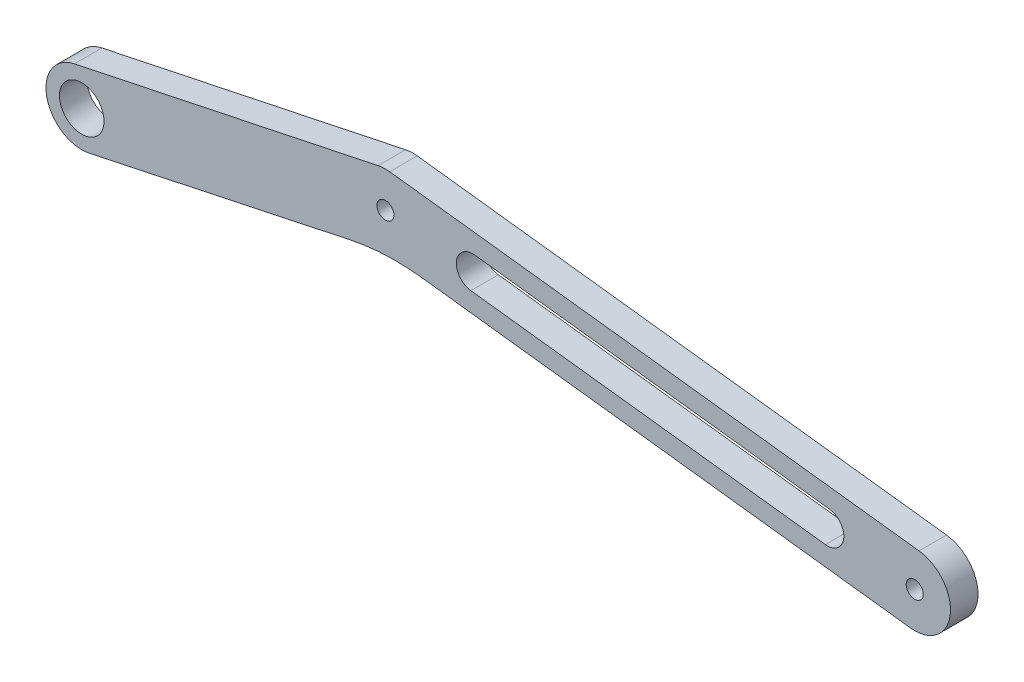
ISO-10303-21;
HEADER;
FILE_DESCRIPTION(('STEP AP214'),'2;1');
FILE_NAME('part.step','',(''),(''),'','','');
FILE_SCHEMA(('AUTOMOTIVE_DESIGN { 1 0 10303 214 1 1 1 1 }'));
ENDSEC;
DATA;
#1=APPLICATION_CONTEXT('core data for automotive mechanical design processes');
#2=APPLICATION_PROTOCOL_DEFINITION('international standard','automotive_design',2000,#1);
#3=PRODUCT_CONTEXT('',#1,'mechanical');
#4=PRODUCT('Part','Part','',(#3));
#5=PRODUCT_RELATED_PRODUCT_CATEGORY('part','',(#4));
#6=PRODUCT_DEFINITION_FORMATION('','',#4);
#7=PRODUCT_DEFINITION_CONTEXT('part definition',#1,'design');
#8=PRODUCT_DEFINITION('design','',#6,#7);
#9=PRODUCT_DEFINITION_SHAPE('','',#8);
#10=(LENGTH_UNIT() NAMED_UNIT(*) SI_UNIT(.MILLI.,.METRE.));
#11=(NAMED_UNIT(*) PLANE_ANGLE_UNIT() SI_UNIT($,.RADIAN.));
#12=(NAMED_UNIT(*) SI_UNIT($,.STERADIAN.) SOLID_ANGLE_UNIT());
#13=UNCERTAINTY_MEASURE_WITH_UNIT(LENGTH_MEASURE(1.E-05),#10,'distance_accuracy_value','');
#14=(GEOMETRIC_REPRESENTATION_CONTEXT(3) GLOBAL_UNCERTAINTY_ASSIGNED_CONTEXT((#13)) GLOBAL_UNIT_ASSIGNED_CONTEXT((#10,
#11,#12)) REPRESENTATION_CONTEXT('',''));
#15=CARTESIAN_POINT('',(0.,0.,0.));
#16=DIRECTION('',(0.,0.,1.));
#17=DIRECTION('',(1.,0.,0.));
#18=AXIS2_PLACEMENT_3D('',#15,#16,#17);
#19=CARTESIAN_POINT('',(-1.33420647911113,6.36159516718079,5.));
#20=DIRECTION('',(-0.205262535247866,0.978706948797043,0.));
#21=DIRECTION('',(-0.978706948797043,-0.205262535247866,0.));
#22=AXIS2_PLACEMENT_3D('',#19,#20,#21);
#23=PLANE('',#22);
#24=DIRECTION('',(0.978706948797043,0.205262535247866,0.));
#25=VECTOR('',#24,1.);
#26=CARTESIAN_POINT('',(-1.33420647911113,6.36159516718079,0.));
#27=LINE('',#26,#25);
#28=CARTESIAN_POINT('',(-1.33420647911113,6.36159516718078,0.));
#29=VERTEX_POINT('',#28);
#30=CARTESIAN_POINT('',(53.8648654330421,17.9384021551604,0.));
#31=VERTEX_POINT('',#30);
#32=EDGE_CURVE('E158',#29,#31,#27,.T.);
#33=ORIENTED_EDGE('',*,*,#32,.F.);
#34=DIRECTION('',(0.,0.,-1.));
#35=VECTOR('',#34,1.);
#36=CARTESIAN_POINT('',(-1.33420647911113,6.36159516718078,5.));
#37=LINE('',#36,#35);
#38=CARTESIAN_POINT('',(-1.33420647911113,6.36159516718078,5.));
#39=VERTEX_POINT('',#38);
#40=EDGE_CURVE('E227',#39,#29,#37,.T.);
#41=ORIENTED_EDGE('',*,*,#40,.F.);
#42=DIRECTION('',(0.978706948797043,0.205262535247866,0.));
#43=VECTOR('',#42,1.);
#44=CARTESIAN_POINT('',(-1.33420647911113,6.36159516718079,5.));
#45=LINE('',#44,#43);
#46=CARTESIAN_POINT('',(53.8648654330421,17.9384021551604,5.));
#47=VERTEX_POINT('',#46);
#48=EDGE_CURVE('E162',#39,#47,#45,.T.);
#49=ORIENTED_EDGE('',*,*,#48,.T.);
#50=DIRECTION('',(0.,0.,-1.));
#51=VECTOR('',#50,1.);
#52=CARTESIAN_POINT('',(53.8648654330421,17.9384021551604,5.));
#53=LINE('',#52,#51);
#54=EDGE_CURVE('E189',#47,#31,#53,.T.);
#55=ORIENTED_EDGE('',*,*,#54,.T.);
#56=EDGE_LOOP('',(#33,#41,#49,#55));
#57=FACE_BOUND('',#56,.T.);
#58=ADVANCED_FACE('F37',(#57),#23,.T.);
#59=CARTESIAN_POINT('',(0.,0.,5.));
#60=DIRECTION('',(0.,0.,-1.));
#61=DIRECTION('',(-1.,0.,0.));
#62=AXIS2_PLACEMENT_3D('',#59,#60,#61);
#63=CYLINDRICAL_SURFACE('',#62,6.5);
#64=CARTESIAN_POINT('',(0.,0.,0.));
#65=DIRECTION('',(0.,0.,1.));
#66=DIRECTION('',(1.,0.,0.));
#67=AXIS2_PLACEMENT_3D('',#64,#65,#66);
#68=CIRCLE('',#67,6.5);
#69=CARTESIAN_POINT('',(1.35019410398763,-6.35822112556311,0.));
#70=VERTEX_POINT('',#69);
#71=EDGE_CURVE('E192',#29,#70,#68,.T.);
#72=ORIENTED_EDGE('',*,*,#71,.T.);
#73=DIRECTION('',(0.,0.,-1.));
#74=VECTOR('',#73,1.);
#75=CARTESIAN_POINT('',(1.35019410398763,-6.35822112556311,5.));
#76=LINE('',#75,#74);
#77=CARTESIAN_POINT('',(1.35019410398763,-6.35822112556311,5.));
#78=VERTEX_POINT('',#77);
#79=EDGE_CURVE('E224',#78,#70,#76,.T.);
#80=ORIENTED_EDGE('',*,*,#79,.F.);
#81=CARTESIAN_POINT('',(0.,0.,5.));
#82=DIRECTION('',(0.,0.,1.));
#83=DIRECTION('',(1.,0.,0.));
#84=AXIS2_PLACEMENT_3D('',#81,#82,#83);
#85=CIRCLE('',#84,6.5);
#86=EDGE_CURVE('E165',#39,#78,#85,.T.);
#87=ORIENTED_EDGE('',*,*,#86,.F.);
#88=ORIENTED_EDGE('',*,*,#40,.T.);
#89=EDGE_LOOP('',(#72,#80,#87,#88));
#90=FACE_BOUND('',#89,.T.);
#91=ADVANCED_FACE('F271',(#90),#63,.T.);
#92=CARTESIAN_POINT('',(1.35019410398763,-6.35822112556311,5.));
#93=DIRECTION('',(-0.207722169844251,0.978187865471248,0.));
#94=DIRECTION('',(-0.978187865471248,-0.207722169844251,0.));
#95=AXIS2_PLACEMENT_3D('',#92,#93,#94);
#96=PLANE('',#95);
#97=DIRECTION('',(0.978187865471248,0.207722169844251,0.));
#98=VECTOR('',#97,1.);
#99=CARTESIAN_POINT('',(1.35019410398763,-6.35822112556311,0.));
#100=LINE('',#99,#98);
#101=CARTESIAN_POINT('',(48.693969002988,3.69542194012794,0.));
#102=VERTEX_POINT('',#101);
#103=EDGE_CURVE('E194',#70,#102,#100,.T.);
#104=ORIENTED_EDGE('',*,*,#103,.T.);
#105=DIRECTION('',(0.,0.,-1.));
#106=VECTOR('',#105,1.);
#107=CARTESIAN_POINT('',(48.693969002988,3.69542194012794,5.));
#108=LINE('',#107,#106);
#109=CARTESIAN_POINT('',(48.693969002988,3.69542194012794,5.));
#110=VERTEX_POINT('',#109);
#111=EDGE_CURVE('E232',#102,#110,#108,.F.);
#112=ORIENTED_EDGE('',*,*,#111,.T.);
#113=DIRECTION('',(0.978187865471248,0.207722169844251,0.));
#114=VECTOR('',#113,1.);
#115=CARTESIAN_POINT('',(1.35019410398763,-6.35822112556311,5.));
#116=LINE('',#115,#114);
#117=EDGE_CURVE('E168',#78,#110,#116,.T.);
#118=ORIENTED_EDGE('',*,*,#117,.F.);
#119=ORIENTED_EDGE('',*,*,#79,.T.);
#120=EDGE_LOOP('',(#104,#112,#118,#119));
#121=FACE_BOUND('',#120,.T.);
#122=ADVANCED_FACE('F242',(#121),#96,.F.);
#123=CARTESIAN_POINT('',(1.39893064921095,11.5775494073441,5.));
#124=DIRECTION('',(0.119958787775372,0.992778872274921,0.));
#125=DIRECTION('',(-0.992778872274921,0.119958787775372,0.));
#126=AXIS2_PLACEMENT_3D('',#123,#124,#125);
#127=PLANE('',#126);
#128=DIRECTION('',(0.992778872274921,-0.119958787775372,0.));
#129=VECTOR('',#128,1.);
#130=CARTESIAN_POINT('',(1.39893064921095,11.5775494073441,5.));
#131=LINE('',#130,#129);
#132=CARTESIAN_POINT('',(61.8012073077729,4.27906221227485,5.));
#133=VERTEX_POINT('',#132);
#134=CARTESIAN_POINT('',(150.62026787946,-6.45306266978699,5.));
#135=VERTEX_POINT('',#134);
#136=EDGE_CURVE('E171',#133,#135,#131,.T.);
#137=ORIENTED_EDGE('',*,*,#136,.F.);
#138=DIRECTION('',(0.,0.,-1.));
#139=VECTOR('',#138,1.);
#140=CARTESIAN_POINT('',(61.8012073077729,4.27906221227485,0.));
#141=LINE('',#140,#139);
#142=CARTESIAN_POINT('',(61.8012073077729,4.27906221227485,0.));
#143=VERTEX_POINT('',#142);
#144=EDGE_CURVE('E229',#133,#143,#141,.T.);
#145=ORIENTED_EDGE('',*,*,#144,.T.);
#146=DIRECTION('',(0.992778872274921,-0.119958787775372,0.));
#147=VECTOR('',#146,1.);
#148=CARTESIAN_POINT('',(1.39893064921095,11.5775494073441,0.));
#149=LINE('',#148,#147);
#150=CARTESIAN_POINT('',(150.62026787946,-6.45306266978699,0.));
#151=VERTEX_POINT('',#150);
#152=EDGE_CURVE('E197',#143,#151,#149,.T.);
#153=ORIENTED_EDGE('',*,*,#152,.T.);
#154=DIRECTION('',(0.,0.,-1.));
#155=VECTOR('',#154,1.);
#156=CARTESIAN_POINT('',(150.62026787946,-6.45306266978699,5.));
#157=LINE('',#156,#155);
#158=EDGE_CURVE('E221',#135,#151,#157,.T.);
#159=ORIENTED_EDGE('',*,*,#158,.F.);
#160=EDGE_LOOP('',(#137,#145,#153,#159));
#161=FACE_BOUND('',#160,.T.);
#162=ADVANCED_FACE('F253',(#161),#127,.F.);
#163=CARTESIAN_POINT('',(151.4,0.,5.));
#164=DIRECTION('',(0.,0.,-1.));
#165=DIRECTION('',(-1.,0.,0.));
#166=AXIS2_PLACEMENT_3D('',#163,#164,#165);
#167=CYLINDRICAL_SURFACE('',#166,6.50000000000002);
#168=CARTESIAN_POINT('',(151.4,0.,0.));
#169=DIRECTION('',(0.,0.,1.));
#170=DIRECTION('',(1.,0.,0.));
#171=AXIS2_PLACEMENT_3D('',#168,#169,#170);
#172=CIRCLE('',#171,6.50000000000002);
#173=CARTESIAN_POINT('',(152.176606072778,6.45343962610047,0.));
#174=VERTEX_POINT('',#173);
#175=EDGE_CURVE('E199',#151,#174,#172,.T.);
#176=ORIENTED_EDGE('',*,*,#175,.T.);
#177=DIRECTION('',(0.,0.,-1.));
#178=VECTOR('',#177,1.);
#179=CARTESIAN_POINT('',(152.176606072778,6.45343962610047,5.));
#180=LINE('',#179,#178);
#181=CARTESIAN_POINT('',(152.176606072778,6.45343962610047,5.));
#182=VERTEX_POINT('',#181);
#183=EDGE_CURVE('E219',#182,#174,#180,.T.);
#184=ORIENTED_EDGE('',*,*,#183,.F.);
#185=CARTESIAN_POINT('',(151.4,0.,5.));
#186=DIRECTION('',(0.,0.,1.));
#187=DIRECTION('',(1.,0.,0.));
#188=AXIS2_PLACEMENT_3D('',#185,#186,#187);
#189=CIRCLE('',#188,6.50000000000002);
#190=EDGE_CURVE('E173',#135,#182,#189,.T.);
#191=ORIENTED_EDGE('',*,*,#190,.F.);
#192=ORIENTED_EDGE('',*,*,#158,.T.);
#193=EDGE_LOOP('',(#176,#184,#191,#192));
#194=FACE_BOUND('',#193,.T.);
#195=ADVANCED_FACE('F257',(#194),#167,.T.);
#196=CARTESIAN_POINT('',(2.9378347740954,24.4128136653032,5.));
#197=DIRECTION('',(0.11947785735053,0.992836865553917,0.));
#198=DIRECTION('',(-0.992836865553917,0.11947785735053,0.));
#199=AXIS2_PLACEMENT_3D('',#196,#197,#198);
#200=PLANE('',#199);
#201=DIRECTION('',(0.992836865553917,-0.11947785735053,0.));
#202=VECTOR('',#201,1.);
#203=CARTESIAN_POINT('',(2.9378347740954,24.4128136653032,0.));
#204=LINE('',#203,#202);
#205=CARTESIAN_POINT('',(55.9756779849317,18.0302466140801,0.));
#206=VERTEX_POINT('',#205);
#207=EDGE_CURVE('E202',#206,#174,#204,.T.);
#208=ORIENTED_EDGE('',*,*,#207,.F.);
#209=DIRECTION('',(0.,0.,-1.));
#210=VECTOR('',#209,1.);
#211=CARTESIAN_POINT('',(55.9756779849317,18.0302466140801,5.));
#212=LINE('',#211,#210);
#213=CARTESIAN_POINT('',(55.9756779849317,18.0302466140801,5.));
#214=VERTEX_POINT('',#213);
#215=EDGE_CURVE('E217',#214,#206,#212,.T.);
#216=ORIENTED_EDGE('',*,*,#215,.F.);
#217=DIRECTION('',(0.992836865553917,-0.11947785735053,0.));
#218=VECTOR('',#217,1.);
#219=CARTESIAN_POINT('',(2.9378347740954,24.4128136653032,5.));
#220=LINE('',#219,#218);
#221=EDGE_CURVE('E175',#214,#182,#220,.T.);
#222=ORIENTED_EDGE('',*,*,#221,.T.);
#223=ORIENTED_EDGE('',*,*,#183,.T.);
#224=EDGE_LOOP('',(#208,#216,#222,#223));
#225=FACE_BOUND('',#224,.T.);
#226=ADVANCED_FACE('F263',(#225),#200,.T.);
#227=CARTESIAN_POINT('',(55.1990719121532,11.5768069879796,5.));
#228=DIRECTION('',(0.,0.,-1.));
#229=DIRECTION('',(-1.,0.,0.));
#230=AXIS2_PLACEMENT_3D('',#227,#228,#229);
#231=CYLINDRICAL_SURFACE('',#230,1.55);
#232=CARTESIAN_POINT('',(55.1990719121532,11.5768069879796,5.));
#233=DIRECTION('',(0.,0.,1.));
#234=DIRECTION('',(1.,0.,0.));
#235=AXIS2_PLACEMENT_3D('',#232,#233,#234);
#236=CIRCLE('',#235,1.55);
#237=CARTESIAN_POINT('',(56.7490719121532,11.5768069879796,5.));
#238=VERTEX_POINT('',#237);
#239=EDGE_CURVE('E183',#238,#238,#236,.T.);
#240=ORIENTED_EDGE('',*,*,#239,.T.);
#241=EDGE_LOOP('',(#240));
#242=FACE_BOUND('',#241,.T.);
#243=CARTESIAN_POINT('',(55.1990719121532,11.5768069879796,0.));
#244=DIRECTION('',(0.,0.,1.));
#245=DIRECTION('',(1.,0.,0.));
#246=AXIS2_PLACEMENT_3D('',#243,#244,#245);
#247=CIRCLE('',#246,1.55);
#248=CARTESIAN_POINT('',(56.7490719121532,11.5768069879796,0.));
#249=VERTEX_POINT('',#248);
#250=EDGE_CURVE('E211',#249,#249,#247,.T.);
#251=ORIENTED_EDGE('',*,*,#250,.F.);
#252=EDGE_LOOP('',(#251));
#253=FACE_BOUND('',#252,.T.);
#254=ADVANCED_FACE('F286',(#242,#253),#231,.F.);
#255=CARTESIAN_POINT('',(0.,0.,5.));
#256=DIRECTION('',(0.,0.,-1.));
#257=DIRECTION('',(-1.,0.,0.));
#258=AXIS2_PLACEMENT_3D('',#255,#256,#257);
#259=CYLINDRICAL_SURFACE('',#258,4.05);
#260=CARTESIAN_POINT('',(0.,0.,5.));
#261=DIRECTION('',(0.,0.,1.));
#262=DIRECTION('',(1.,0.,0.));
#263=AXIS2_PLACEMENT_3D('',#260,#261,#262);
#264=CIRCLE('',#263,4.05);
#265=CARTESIAN_POINT('',(4.05,0.,5.));
#266=VERTEX_POINT('',#265);
#267=EDGE_CURVE('E180',#266,#266,#264,.T.);
#268=ORIENTED_EDGE('',*,*,#267,.T.);
#269=EDGE_LOOP('',(#268));
#270=FACE_BOUND('',#269,.T.);
#271=CARTESIAN_POINT('',(0.,0.,0.));
#272=DIRECTION('',(0.,0.,1.));
#273=DIRECTION('',(1.,0.,0.));
#274=AXIS2_PLACEMENT_3D('',#271,#272,#273);
#275=CIRCLE('',#274,4.05);
#276=CARTESIAN_POINT('',(4.05,0.,0.));
#277=VERTEX_POINT('',#276);
#278=EDGE_CURVE('E208',#277,#277,#275,.T.);
#279=ORIENTED_EDGE('',*,*,#278,.F.);
#280=EDGE_LOOP('',(#279));
#281=FACE_BOUND('',#280,.T.);
#282=ADVANCED_FACE('F290',(#270,#281),#259,.F.);
#283=CARTESIAN_POINT('',(55.1990719121532,11.5768069879796,5.));
#284=DIRECTION('',(0.,0.,-1.));
#285=DIRECTION('',(-1.,0.,0.));
#286=AXIS2_PLACEMENT_3D('',#283,#284,#285);
#287=CYLINDRICAL_SURFACE('',#286,6.5);
#288=CARTESIAN_POINT('',(55.1990719121532,11.5768069879796,0.));
#289=DIRECTION('',(0.,0.,1.));
#290=DIRECTION('',(1.,0.,0.));
#291=AXIS2_PLACEMENT_3D('',#288,#289,#290);
#292=CIRCLE('',#291,6.5);
#293=EDGE_CURVE('E205',#206,#31,#292,.T.);
#294=ORIENTED_EDGE('',*,*,#293,.T.);
#295=ORIENTED_EDGE('',*,*,#54,.F.);
#296=CARTESIAN_POINT('',(55.1990719121532,11.5768069879796,5.));
#297=DIRECTION('',(0.,0.,1.));
#298=DIRECTION('',(1.,0.,0.));
#299=AXIS2_PLACEMENT_3D('',#296,#297,#298);
#300=CIRCLE('',#299,6.5);
#301=EDGE_CURVE('E178',#214,#47,#300,.T.);
#302=ORIENTED_EDGE('',*,*,#301,.F.);
#303=ORIENTED_EDGE('',*,*,#215,.T.);
#304=EDGE_LOOP('',(#294,#295,#302,#303));
#305=FACE_BOUND('',#304,.T.);
#306=ADVANCED_FACE('F266',(#305),#287,.T.);
#307=CARTESIAN_POINT('',(151.4,0.,5.));
#308=DIRECTION('',(0.,0.,-1.));
#309=DIRECTION('',(-1.,0.,0.));
#310=AXIS2_PLACEMENT_3D('',#307,#308,#309);
#311=CYLINDRICAL_SURFACE('',#310,1.54999999999999);
#312=CARTESIAN_POINT('',(151.4,0.,5.));
#313=DIRECTION('',(0.,0.,1.));
#314=DIRECTION('',(1.,0.,0.));
#315=AXIS2_PLACEMENT_3D('',#312,#313,#314);
#316=CIRCLE('',#315,1.54999999999999);
#317=CARTESIAN_POINT('',(152.95,0.,5.));
#318=VERTEX_POINT('',#317);
#319=EDGE_CURVE('E186',#318,#318,#316,.T.);
#320=ORIENTED_EDGE('',*,*,#319,.T.);
#321=EDGE_LOOP('',(#320));
#322=FACE_BOUND('',#321,.T.);
#323=CARTESIAN_POINT('',(151.4,0.,0.));
#324=DIRECTION('',(0.,0.,1.));
#325=DIRECTION('',(1.,0.,0.));
#326=AXIS2_PLACEMENT_3D('',#323,#324,#325);
#327=CIRCLE('',#326,1.54999999999999);
#328=CARTESIAN_POINT('',(152.95,0.,0.));
#329=VERTEX_POINT('',#328);
#330=EDGE_CURVE('E166',#329,#329,#327,.T.);
#331=ORIENTED_EDGE('',*,*,#330,.F.);
#332=EDGE_LOOP('',(#331));
#333=FACE_BOUND('',#332,.T.);
#334=ADVANCED_FACE('F289',(#322,#333),#311,.F.);
#335=CARTESIAN_POINT('',(0.,0.,5.));
#336=DIRECTION('',(0.,0.,1.));
#337=DIRECTION('',(1.,0.,0.));
#338=AXIS2_PLACEMENT_3D('',#335,#336,#337);
#339=PLANE('',#338);
#340=CARTESIAN_POINT('',(71.0844617610159,9.66516127037115,5.));
#341=DIRECTION('',(0.,0.,1.));
#342=DIRECTION('',(1.,0.,0.));
#343=AXIS2_PLACEMENT_3D('',#340,#341,#342);
#344=CIRCLE('',#343,3.);
#345=CARTESIAN_POINT('',(71.4428953330675,12.6436718670329,5.));
#346=VERTEX_POINT('',#345);
#347=CARTESIAN_POINT('',(70.7260281889643,6.6866506737094,5.));
#348=VERTEX_POINT('',#347);
#349=EDGE_CURVE('E52',#346,#348,#344,.T.);
#350=ORIENTED_EDGE('',*,*,#349,.F.);
#351=DIRECTION('',(-0.992836865553917,0.11947785735053,0.));
#352=VECTOR('',#351,1.);
#353=CARTESIAN_POINT('',(71.4428953330675,12.6436718670329,5.));
#354=LINE('',#353,#352);
#355=CARTESIAN_POINT('',(135.873043723189,4.89015631427024,5.));
#356=VERTEX_POINT('',#355);
#357=EDGE_CURVE('E143',#356,#346,#354,.T.);
#358=ORIENTED_EDGE('',*,*,#357,.F.);
#359=CARTESIAN_POINT('',(135.514610151137,1.91164571760848,5.));
#360=DIRECTION('',(0.,0.,1.));
#361=DIRECTION('',(1.,0.,0.));
#362=AXIS2_PLACEMENT_3D('',#359,#360,#361);
#363=CIRCLE('',#362,3.00000000000001);
#364=CARTESIAN_POINT('',(135.156176579086,-1.06686487905327,5.));
#365=VERTEX_POINT('',#364);
#366=EDGE_CURVE('E146',#365,#356,#363,.T.);
#367=ORIENTED_EDGE('',*,*,#366,.F.);
#368=DIRECTION('',(0.992836865553917,-0.11947785735053,0.));
#369=VECTOR('',#368,1.);
#370=CARTESIAN_POINT('',(70.7260281889643,6.6866506737094,5.));
#371=LINE('',#370,#369);
#372=EDGE_CURVE('E152',#348,#365,#371,.T.);
#373=ORIENTED_EDGE('',*,*,#372,.F.);
#374=EDGE_LOOP('',(#350,#358,#367,#373));
#375=FACE_BOUND('',#374,.T.);
#376=ORIENTED_EDGE('',*,*,#48,.F.);
#377=ORIENTED_EDGE('',*,*,#86,.T.);
#378=ORIENTED_EDGE('',*,*,#117,.T.);
#379=CARTESIAN_POINT('',(57.002855796758,-35.432092678722,5.));
#380=DIRECTION('',(0.,0.,1.));
#381=DIRECTION('',(1.,0.,0.));
#382=AXIS2_PLACEMENT_3D('',#379,#380,#381);
#383=CIRCLE('',#382,40.);
#384=EDGE_CURVE('E11',#110,#133,#383,.F.);
#385=ORIENTED_EDGE('',*,*,#384,.T.);
#386=ORIENTED_EDGE('',*,*,#136,.T.);
#387=ORIENTED_EDGE('',*,*,#190,.T.);
#388=ORIENTED_EDGE('',*,*,#221,.F.);
#389=ORIENTED_EDGE('',*,*,#301,.T.);
#390=EDGE_LOOP('',(#376,#377,#378,#385,#386,#387,#388,#389));
#391=FACE_BOUND('',#390,.T.);
#392=ORIENTED_EDGE('',*,*,#267,.F.);
#393=EDGE_LOOP('',(#392));
#394=FACE_BOUND('',#393,.T.);
#395=ORIENTED_EDGE('',*,*,#239,.F.);
#396=EDGE_LOOP('',(#395));
#397=FACE_BOUND('',#396,.T.);
#398=ORIENTED_EDGE('',*,*,#319,.F.);
#399=EDGE_LOOP('',(#398));
#400=FACE_BOUND('',#399,.T.);
#401=ADVANCED_FACE('F249',(#375,#391,#394,#397,#400),#339,.T.);
#402=CARTESIAN_POINT('',(0.,0.,0.));
#403=DIRECTION('',(0.,0.,1.));
#404=DIRECTION('',(1.,0.,0.));
#405=AXIS2_PLACEMENT_3D('',#402,#403,#404);
#406=PLANE('',#405);
#407=DIRECTION('',(-0.992836865553917,0.11947785735053,0.));
#408=VECTOR('',#407,1.);
#409=CARTESIAN_POINT('',(71.4428953330675,12.6436718670329,0.));
#410=LINE('',#409,#408);
#411=CARTESIAN_POINT('',(135.873043723189,4.89015631427024,0.));
#412=VERTEX_POINT('',#411);
#413=CARTESIAN_POINT('',(71.4428953330675,12.6436718670329,0.));
#414=VERTEX_POINT('',#413);
#415=EDGE_CURVE('E133',#412,#414,#410,.T.);
#416=ORIENTED_EDGE('',*,*,#415,.T.);
#417=CARTESIAN_POINT('',(71.0844617610159,9.66516127037115,0.));
#418=DIRECTION('',(0.,0.,1.));
#419=DIRECTION('',(1.,0.,0.));
#420=AXIS2_PLACEMENT_3D('',#417,#418,#419);
#421=CIRCLE('',#420,3.);
#422=CARTESIAN_POINT('',(70.7260281889643,6.6866506737094,0.));
#423=VERTEX_POINT('',#422);
#424=EDGE_CURVE('E127',#414,#423,#421,.T.);
#425=ORIENTED_EDGE('',*,*,#424,.T.);
#426=DIRECTION('',(0.992836865553917,-0.11947785735053,0.));
#427=VECTOR('',#426,1.);
#428=CARTESIAN_POINT('',(70.7260281889643,6.6866506737094,0.));
#429=LINE('',#428,#427);
#430=CARTESIAN_POINT('',(135.156176579086,-1.06686487905327,0.));
#431=VERTEX_POINT('',#430);
#432=EDGE_CURVE('E136',#423,#431,#429,.T.);
#433=ORIENTED_EDGE('',*,*,#432,.T.);
#434=CARTESIAN_POINT('',(135.514610151137,1.91164571760848,0.));
#435=DIRECTION('',(0.,0.,1.));
#436=DIRECTION('',(1.,0.,0.));
#437=AXIS2_PLACEMENT_3D('',#434,#435,#436);
#438=CIRCLE('',#437,3.00000000000001);
#439=EDGE_CURVE('E60',#431,#412,#438,.T.);
#440=ORIENTED_EDGE('',*,*,#439,.T.);
#441=EDGE_LOOP('',(#416,#425,#433,#440));
#442=FACE_BOUND('',#441,.T.);
#443=ORIENTED_EDGE('',*,*,#32,.T.);
#444=ORIENTED_EDGE('',*,*,#293,.F.);
#445=ORIENTED_EDGE('',*,*,#207,.T.);
#446=ORIENTED_EDGE('',*,*,#175,.F.);
#447=ORIENTED_EDGE('',*,*,#152,.F.);
#448=CARTESIAN_POINT('',(57.002855796758,-35.432092678722,0.));
#449=DIRECTION('',(0.,0.,1.));
#450=DIRECTION('',(1.,0.,0.));
#451=AXIS2_PLACEMENT_3D('',#448,#449,#450);
#452=CIRCLE('',#451,40.);
#453=EDGE_CURVE('E45',#143,#102,#452,.T.);
#454=ORIENTED_EDGE('',*,*,#453,.T.);
#455=ORIENTED_EDGE('',*,*,#103,.F.);
#456=ORIENTED_EDGE('',*,*,#71,.F.);
#457=EDGE_LOOP('',(#443,#444,#445,#446,#447,#454,#455,#456));
#458=FACE_BOUND('',#457,.T.);
#459=ORIENTED_EDGE('',*,*,#278,.T.);
#460=EDGE_LOOP('',(#459));
#461=FACE_BOUND('',#460,.T.);
#462=ORIENTED_EDGE('',*,*,#250,.T.);
#463=EDGE_LOOP('',(#462));
#464=FACE_BOUND('',#463,.T.);
#465=ORIENTED_EDGE('',*,*,#330,.T.);
#466=EDGE_LOOP('',(#465));
#467=FACE_BOUND('',#466,.T.);
#468=ADVANCED_FACE('F140',(#442,#458,#461,#464,#467),#406,.F.);
#469=CARTESIAN_POINT('',(57.002855796758,-35.432092678722,5.));
#470=DIRECTION('',(0.,0.,1.));
#471=DIRECTION('',(1.,0.,0.));
#472=AXIS2_PLACEMENT_3D('',#469,#470,#471);
#473=CYLINDRICAL_SURFACE('',#472,40.);
#474=ORIENTED_EDGE('',*,*,#384,.F.);
#475=ORIENTED_EDGE('',*,*,#111,.F.);
#476=ORIENTED_EDGE('',*,*,#453,.F.);
#477=ORIENTED_EDGE('',*,*,#144,.F.);
#478=EDGE_LOOP('',(#474,#475,#476,#477));
#479=FACE_BOUND('',#478,.T.);
#480=ADVANCED_FACE('F39',(#479),#473,.F.);
#481=CARTESIAN_POINT('',(71.0844617610159,9.66516127037115,0.));
#482=DIRECTION('',(0.,0.,1.));
#483=DIRECTION('',(1.,0.,0.));
#484=AXIS2_PLACEMENT_3D('',#481,#482,#483);
#485=CYLINDRICAL_SURFACE('',#484,3.);
#486=ORIENTED_EDGE('',*,*,#349,.T.);
#487=DIRECTION('',(0.,0.,1.));
#488=VECTOR('',#487,1.);
#489=CARTESIAN_POINT('',(70.7260281889643,6.6866506737094,0.));
#490=LINE('',#489,#488);
#491=EDGE_CURVE('E123',#423,#348,#490,.T.);
#492=ORIENTED_EDGE('',*,*,#491,.F.);
#493=ORIENTED_EDGE('',*,*,#424,.F.);
#494=DIRECTION('',(0.,0.,1.));
#495=VECTOR('',#494,1.);
#496=CARTESIAN_POINT('',(71.4428953330675,12.6436718670329,0.));
#497=LINE('',#496,#495);
#498=EDGE_CURVE('E156',#414,#346,#497,.T.);
#499=ORIENTED_EDGE('',*,*,#498,.T.);
#500=EDGE_LOOP('',(#486,#492,#493,#499));
#501=FACE_BOUND('',#500,.T.);
#502=ADVANCED_FACE('F125',(#501),#485,.F.);
#503=CARTESIAN_POINT('',(71.4428953330675,12.6436718670329,0.));
#504=DIRECTION('',(0.11947785735053,0.992836865553917,0.));
#505=DIRECTION('',(-0.992836865553917,0.11947785735053,0.));
#506=AXIS2_PLACEMENT_3D('',#503,#504,#505);
#507=PLANE('',#506);
#508=ORIENTED_EDGE('',*,*,#357,.T.);
#509=ORIENTED_EDGE('',*,*,#498,.F.);
#510=ORIENTED_EDGE('',*,*,#415,.F.);
#511=DIRECTION('',(0.,0.,1.));
#512=VECTOR('',#511,1.);
#513=CARTESIAN_POINT('',(135.873043723189,4.89015631427024,0.));
#514=LINE('',#513,#512);
#515=EDGE_CURVE('E159',#412,#356,#514,.T.);
#516=ORIENTED_EDGE('',*,*,#515,.T.);
#517=EDGE_LOOP('',(#508,#509,#510,#516));
#518=FACE_BOUND('',#517,.T.);
#519=ADVANCED_FACE('F307',(#518),#507,.F.);
#520=CARTESIAN_POINT('',(135.514610151137,1.91164571760848,0.));
#521=DIRECTION('',(0.,0.,1.));
#522=DIRECTION('',(1.,0.,0.));
#523=AXIS2_PLACEMENT_3D('',#520,#521,#522);
#524=CYLINDRICAL_SURFACE('',#523,3.00000000000001);
#525=ORIENTED_EDGE('',*,*,#366,.T.);
#526=ORIENTED_EDGE('',*,*,#515,.F.);
#527=ORIENTED_EDGE('',*,*,#439,.F.);
#528=DIRECTION('',(0.,0.,1.));
#529=VECTOR('',#528,1.);
#530=CARTESIAN_POINT('',(135.156176579086,-1.06686487905327,0.));
#531=LINE('',#530,#529);
#532=EDGE_CURVE('E132',#431,#365,#531,.T.);
#533=ORIENTED_EDGE('',*,*,#532,.T.);
#534=EDGE_LOOP('',(#525,#526,#527,#533));
#535=FACE_BOUND('',#534,.T.);
#536=ADVANCED_FACE('F310',(#535),#524,.F.);
#537=CARTESIAN_POINT('',(70.7260281889643,6.6866506737094,0.));
#538=DIRECTION('',(-0.11947785735053,-0.992836865553917,0.));
#539=DIRECTION('',(0.992836865553917,-0.11947785735053,0.));
#540=AXIS2_PLACEMENT_3D('',#537,#538,#539);
#541=PLANE('',#540);
#542=ORIENTED_EDGE('',*,*,#372,.T.);
#543=ORIENTED_EDGE('',*,*,#532,.F.);
#544=ORIENTED_EDGE('',*,*,#432,.F.);
#545=ORIENTED_EDGE('',*,*,#491,.T.);
#546=EDGE_LOOP('',(#542,#543,#544,#545));
#547=FACE_BOUND('',#546,.T.);
#548=ADVANCED_FACE('F137',(#547),#541,.F.);
#549=CLOSED_SHELL('',(#58,#91,#122,#162,#195,#226,#254,#282,#306,#334,#401,#468,#480,#502,#519,
#536,#548));
#550=MANIFOLD_SOLID_BREP('B2',#549);
#551=ADVANCED_BREP_SHAPE_REPRESENTATION('',(#18,#550),#14);
#552=SHAPE_DEFINITION_REPRESENTATION(#9,#551);
ENDSEC;
END-ISO-10303-21;
